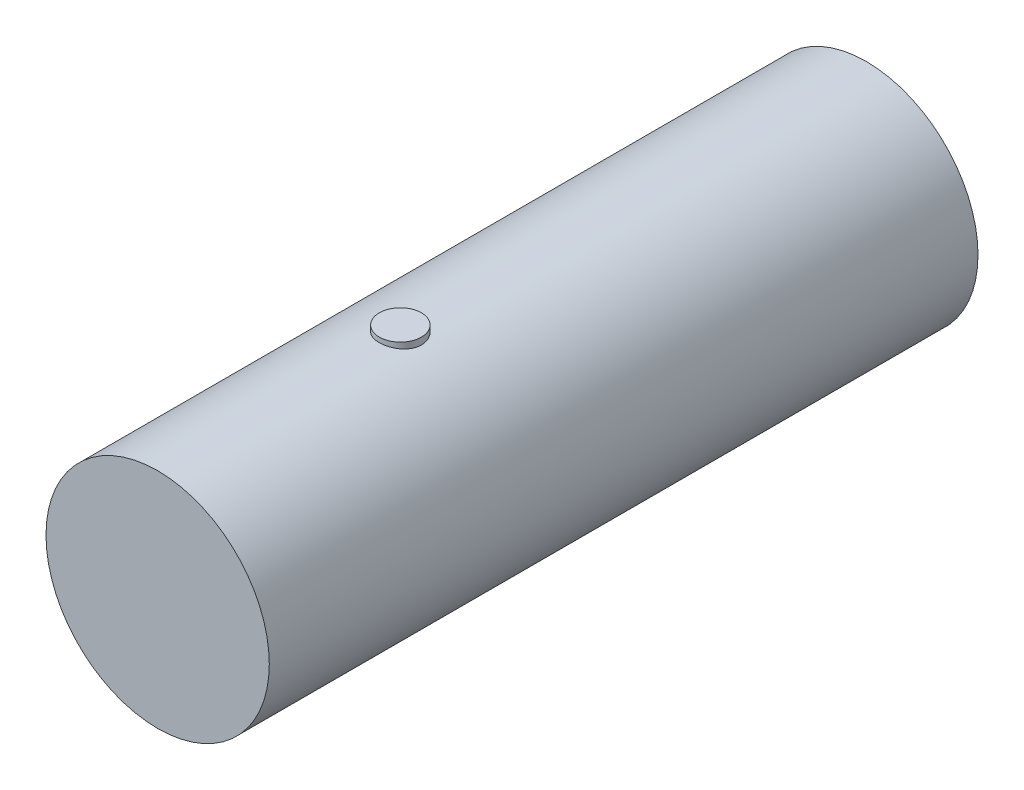
ISO-10303-21;
HEADER;
FILE_DESCRIPTION(('STEP AP214'),'2;1');
FILE_NAME('part.step','',(''),(''),'','','');
FILE_SCHEMA(('AUTOMOTIVE_DESIGN { 1 0 10303 214 1 1 1 1 }'));
ENDSEC;
DATA;
#1=APPLICATION_CONTEXT('core data for automotive mechanical design processes');
#2=APPLICATION_PROTOCOL_DEFINITION('international standard','automotive_design',2000,#1);
#3=PRODUCT_CONTEXT('',#1,'mechanical');
#4=PRODUCT('Part','Part','',(#3));
#5=PRODUCT_RELATED_PRODUCT_CATEGORY('part','',(#4));
#6=PRODUCT_DEFINITION_FORMATION('','',#4);
#7=PRODUCT_DEFINITION_CONTEXT('part definition',#1,'design');
#8=PRODUCT_DEFINITION('design','',#6,#7);
#9=PRODUCT_DEFINITION_SHAPE('','',#8);
#10=(LENGTH_UNIT() NAMED_UNIT(*) SI_UNIT(.MILLI.,.METRE.));
#11=(NAMED_UNIT(*) PLANE_ANGLE_UNIT() SI_UNIT($,.RADIAN.));
#12=(NAMED_UNIT(*) SI_UNIT($,.STERADIAN.) SOLID_ANGLE_UNIT());
#13=UNCERTAINTY_MEASURE_WITH_UNIT(LENGTH_MEASURE(1.E-05),#10,'distance_accuracy_value','');
#14=(GEOMETRIC_REPRESENTATION_CONTEXT(3) GLOBAL_UNCERTAINTY_ASSIGNED_CONTEXT((#13)) GLOBAL_UNIT_ASSIGNED_CONTEXT((#10,
#11,#12)) REPRESENTATION_CONTEXT('',''));
#15=CARTESIAN_POINT('',(0.,0.,0.));
#16=DIRECTION('',(0.,0.,1.));
#17=DIRECTION('',(1.,0.,0.));
#18=AXIS2_PLACEMENT_3D('',#15,#16,#17);
#19=CARTESIAN_POINT('',(0.,0.,730.));
#20=DIRECTION('',(0.,0.,-1.));
#21=DIRECTION('',(-1.,0.,0.));
#22=AXIS2_PLACEMENT_3D('',#19,#20,#21);
#23=CYLINDRICAL_SURFACE('',#22,115.);
#24=CARTESIAN_POINT('',(0.,-115.,501.686343762206));
#25=CARTESIAN_POINT('',(0.603410928443423,-114.999998479308,501.68634033262));
#26=CARTESIAN_POINT('',(1.20690152688971,-114.995238524341,501.661137861267));
#27=CARTESIAN_POINT('',(2.40959715212932,-114.976326973157,501.560511348795));
#28=CARTESIAN_POINT('',(3.0088013905343,-114.962173691952,501.485078297245));
#29=CARTESIAN_POINT('',(4.19902662980545,-114.924857729453,501.284504802048));
#30=CARTESIAN_POINT('',(4.79004102718549,-114.90168817152,501.159326416504));
#31=CARTESIAN_POINT('',(5.95917839647016,-114.84698817239,500.860244081916));
#32=CARTESIAN_POINT('',(6.53730192525976,-114.815458093129,500.686342242144));
#33=CARTESIAN_POINT('',(7.67612155719963,-114.744944836291,500.291317723911));
#34=CARTESIAN_POINT('',(8.23683297430943,-114.70596843676,500.070237968116));
#35=CARTESIAN_POINT('',(9.33752210700834,-114.62161831084,499.582404649574));
#36=CARTESIAN_POINT('',(9.87749961867847,-114.576244521553,499.315650637758));
#37=CARTESIAN_POINT('',(10.9330050367083,-114.480348695138,498.738428238));
#38=CARTESIAN_POINT('',(11.4485354116939,-114.429827179447,498.427964276426));
#39=CARTESIAN_POINT('',(12.4517614280236,-114.325010607594,497.765485877765));
#40=CARTESIAN_POINT('',(12.9394568842235,-114.270715526337,497.41347116435));
#41=CARTESIAN_POINT('',(13.8889055540433,-114.159227774367,496.66627405708));
#42=CARTESIAN_POINT('',(14.3503199242369,-114.10201005857,496.270664775416));
#43=CARTESIAN_POINT('',(15.238283657022,-113.986820308274,495.442180590485));
#44=CARTESIAN_POINT('',(15.6648327608723,-113.928848268182,495.00930541071));
#45=CARTESIAN_POINT('',(16.480193144543,-113.813763709515,494.109199575498));
#46=CARTESIAN_POINT('',(16.8690017720277,-113.756651251588,493.641966509497));
#47=CARTESIAN_POINT('',(17.6061674905007,-113.644893827428,492.67632992873));
#48=CARTESIAN_POINT('',(17.9545244775689,-113.590248867533,492.177926333893));
#49=CARTESIAN_POINT('',(18.6109654730042,-113.484551479374,491.14920361048));
#50=CARTESIAN_POINT('',(18.9187034082234,-113.433531444014,490.618660223656));
#51=CARTESIAN_POINT('',(19.4883292979325,-113.337057122307,489.533011215671));
#52=CARTESIAN_POINT('',(19.7502169355965,-113.29160287442,488.977905424818));
#53=CARTESIAN_POINT('',(20.2261485831619,-113.207602863491,487.847082628774));
#54=CARTESIAN_POINT('',(20.4401958377841,-113.169056631956,487.271367024496));
#55=CARTESIAN_POINT('',(20.8188051191566,-113.100019558419,486.103417576606));
#56=CARTESIAN_POINT('',(20.9833677982044,-113.069528610235,485.511183950845));
#57=CARTESIAN_POINT('',(21.2600711046623,-113.017825905578,484.321513760491));
#58=CARTESIAN_POINT('',(21.3728024273105,-112.996509776887,483.724219095712));
#59=CARTESIAN_POINT('',(21.5477584360319,-112.963277475596,482.522018032881));
#60=CARTESIAN_POINT('',(21.60998347705,-112.951361236936,481.917111688353));
#61=CARTESIAN_POINT('',(21.6834228872716,-112.937286032847,480.70414535094));
#62=CARTESIAN_POINT('',(21.6946413232615,-112.935126289527,480.096085613346));
#63=CARTESIAN_POINT('',(21.6659873155799,-112.940626911343,478.88121837369));
#64=CARTESIAN_POINT('',(21.6261152482131,-112.948287204149,478.274410862437));
#65=CARTESIAN_POINT('',(21.4964769989496,-112.973031045073,477.074554155652));
#66=CARTESIAN_POINT('',(21.4073841144685,-112.98998740768,476.481429438388));
#67=CARTESIAN_POINT('',(21.1804751104198,-113.032742083519,475.304906961762));
#68=CARTESIAN_POINT('',(21.0426594908115,-113.058540306023,474.721509102653));
#69=CARTESIAN_POINT('',(20.7193550090204,-113.118236010455,473.568487993552));
#70=CARTESIAN_POINT('',(20.533864733448,-113.152133732503,472.998865152489));
#71=CARTESIAN_POINT('',(20.1165987670819,-113.2270610209,471.87731785964));
#72=CARTESIAN_POINT('',(19.8848226479777,-113.268090653244,471.325393571684));
#73=CARTESIAN_POINT('',(19.3751334380059,-113.356391365091,470.23969703558));
#74=CARTESIAN_POINT('',(19.0969496888235,-113.403698705315,469.706054816658));
#75=CARTESIAN_POINT('',(18.497434152603,-113.503027293693,468.664050900801));
#76=CARTESIAN_POINT('',(18.1761022614261,-113.555048553224,468.155689264887));
#77=CARTESIAN_POINT('',(17.4924998405668,-113.662360165621,467.167583902252));
#78=CARTESIAN_POINT('',(17.1302257796048,-113.717650800275,466.687842649514));
#79=CARTESIAN_POINT('',(16.3672272296531,-113.829971999644,465.760194353576));
#80=CARTESIAN_POINT('',(15.9665023194669,-113.887002583413,465.31228765919));
#81=CARTESIAN_POINT('',(15.122596567777,-114.002154627059,464.444398286282));
#82=CARTESIAN_POINT('',(14.6788401302188,-114.060278968611,464.024975470015));
#83=CARTESIAN_POINT('',(13.7574398418711,-114.175077585431,463.22494049285));
#84=CARTESIAN_POINT('',(13.2797956140495,-114.231751844558,462.844328763874));
#85=CARTESIAN_POINT('',(12.2938728700095,-114.342060042819,462.124577856691));
#86=CARTESIAN_POINT('',(11.7855938630734,-114.395693933226,461.785439343078));
#87=CARTESIAN_POINT('',(10.7418965635053,-114.498412970124,461.151071908953));
#88=CARTESIAN_POINT('',(10.2064783819104,-114.547498135223,460.85584280881));
#89=CARTESIAN_POINT('',(9.11150541665886,-114.639795365827,460.311110366966));
#90=CARTESIAN_POINT('',(8.55192038531121,-114.6829997727,460.061666507819));
#91=CARTESIAN_POINT('',(7.41320565943902,-114.762232800078,459.610864274964));
#92=CARTESIAN_POINT('',(6.83407591222441,-114.798261401234,459.409506030902));
#93=CARTESIAN_POINT('',(5.66047874275129,-114.862109808594,459.056458202383));
#94=CARTESIAN_POINT('',(5.06601266946913,-114.889930334117,458.904764265438));
#95=CARTESIAN_POINT('',(3.86602914611988,-114.936566460762,458.652230985896));
#96=CARTESIAN_POINT('',(3.26051184678311,-114.955382184607,458.551390950226));
#97=CARTESIAN_POINT('',(2.05199309495855,-114.983256094479,458.402501234785));
#98=CARTESIAN_POINT('',(1.44908919481187,-114.992455849795,458.353685421447));
#99=CARTESIAN_POINT('',(0.241243315370328,-115.001332709821,458.306577626242));
#100=CARTESIAN_POINT('',(-0.363698643618266,-115.001009909131,458.308285142464));
#101=CARTESIAN_POINT('',(-1.57121658735387,-114.990851040459,458.362208442856));
#102=CARTESIAN_POINT('',(-2.1737926813114,-114.981015416907,458.414421867437));
#103=CARTESIAN_POINT('',(-3.37226148029988,-114.952108084768,458.568938255338));
#104=CARTESIAN_POINT('',(-3.96815419641428,-114.933036391501,458.671241135579));
#105=CARTESIAN_POINT('',(-5.14430955734777,-114.886377552673,458.924124092238));
#106=CARTESIAN_POINT('',(-5.72465864144907,-114.858859084722,459.074315175869));
#107=CARTESIAN_POINT('',(-6.8705461376929,-114.796014185086,459.422060408162));
#108=CARTESIAN_POINT('',(-7.43608465366947,-114.760687808155,459.619614224674));
#109=CARTESIAN_POINT('',(-8.54851169703409,-114.683189163443,460.060630039465));
#110=CARTESIAN_POINT('',(-9.09539925892533,-114.641016541902,460.304094410132));
#111=CARTESIAN_POINT('',(-10.1668145490839,-114.55097092541,460.835165217287));
#112=CARTESIAN_POINT('',(-10.6913420219751,-114.503097865377,461.12277215776));
#113=CARTESIAN_POINT('',(-11.7202015596036,-114.402390813311,461.74351296201));
#114=CARTESIAN_POINT('',(-12.2242468280903,-114.349507898652,462.077114276455));
#115=CARTESIAN_POINT('',(-13.2025337839056,-114.240690552008,462.785030769096));
#116=CARTESIAN_POINT('',(-13.6767752835203,-114.184756100807,463.159346203682));
#117=CARTESIAN_POINT('',(-14.5923251341038,-114.07136750167,463.94615600913));
#118=CARTESIAN_POINT('',(-15.0336307476665,-114.013913227953,464.358653547058));
#119=CARTESIAN_POINT('',(-15.8803134988249,-113.899070279191,465.219017906046));
#120=CARTESIAN_POINT('',(-16.28569036246,-113.841681604649,465.666884996753));
#121=CARTESIAN_POINT('',(-17.0629757498403,-113.727794594203,466.601246019251));
#122=CARTESIAN_POINT('',(-17.4343602831979,-113.671318642953,467.088178765694));
#123=CARTESIAN_POINT('',(-18.134790777787,-113.561679605116,468.09195991537));
#124=CARTESIAN_POINT('',(-18.4638363080415,-113.508516552253,468.608808623046));
#125=CARTESIAN_POINT('',(-19.0772010518043,-113.40704156121,469.668840283264));
#126=CARTESIAN_POINT('',(-19.3615213502893,-113.358729505362,470.212022596568));
#127=CARTESIAN_POINT('',(-19.8833308938377,-113.268368548563,471.320936616474));
#128=CARTESIAN_POINT('',(-20.1208205564517,-113.226319591771,471.88666812197));
#129=CARTESIAN_POINT('',(-20.5461099237842,-113.149917602119,473.033849212043));
#130=CARTESIAN_POINT('',(-20.7341475917761,-113.115527840436,473.615208111934));
#131=CARTESIAN_POINT('',(-21.0605919767159,-113.055203564872,474.792131818335));
#132=CARTESIAN_POINT('',(-21.198998783084,-113.029269035756,475.387696599248));
#133=CARTESIAN_POINT('',(-21.4250673618696,-112.986635239289,476.588650344653));
#134=CARTESIAN_POINT('',(-21.5127340085041,-112.969935084869,477.194038359756));
#135=CARTESIAN_POINT('',(-21.6366306524008,-112.946271348791,478.410241852668));
#136=CARTESIAN_POINT('',(-21.6728612876089,-112.939307646376,479.021057263068));
#137=CARTESIAN_POINT('',(-21.6934252885051,-112.935359346544,480.23375281502));
#138=CARTESIAN_POINT('',(-21.678584262859,-112.938215995593,480.83561860039));
#139=CARTESIAN_POINT('',(-21.5989429051676,-112.953474073414,482.035908051277));
#140=CARTESIAN_POINT('',(-21.5341431419893,-112.965875393504,482.63433175591));
#141=CARTESIAN_POINT('',(-21.3550973053761,-112.999858853634,483.82346019942));
#142=CARTESIAN_POINT('',(-21.2408517940696,-113.021440889302,484.41416502597));
#143=CARTESIAN_POINT('',(-20.9638031053921,-113.073156801196,485.583691139615));
#144=CARTESIAN_POINT('',(-20.8009997423754,-113.103290710116,486.162512381267));
#145=CARTESIAN_POINT('',(-20.4284364788906,-113.171174462504,487.303133287709));
#146=CARTESIAN_POINT('',(-20.2187677981103,-113.20890949706,487.864963644096));
#147=CARTESIAN_POINT('',(-19.7538482350839,-113.29095798076,488.968930455403));
#148=CARTESIAN_POINT('',(-19.4985974893121,-113.335271410207,489.511066969281));
#149=CARTESIAN_POINT('',(-18.944334261465,-113.429234186239,490.572035915902));
#150=CARTESIAN_POINT('',(-18.6453194519445,-113.478883816576,491.09086710731));
#151=CARTESIAN_POINT('',(-18.0056282270393,-113.582138893698,492.101762267624));
#152=CARTESIAN_POINT('',(-17.6649513096558,-113.635744388146,492.593825913896));
#153=CARTESIAN_POINT('',(-16.938796703294,-113.746270407383,493.555184169366));
#154=CARTESIAN_POINT('',(-16.5527185652309,-113.803228846821,494.02402098587));
#155=CARTESIAN_POINT('',(-15.7426791519397,-113.91810806804,494.927616435533));
#156=CARTESIAN_POINT('',(-15.3187174069761,-113.976028861747,495.362374646011));
#157=CARTESIAN_POINT('',(-14.4356905622867,-114.091231406851,496.194957774628));
#158=CARTESIAN_POINT('',(-13.9766174013943,-114.148513008016,496.592774164663));
#159=CARTESIAN_POINT('',(-13.0265594141635,-114.26083102561,497.348623345724));
#160=CARTESIAN_POINT('',(-12.535574862021,-114.315867461323,497.706656478514));
#161=CARTESIAN_POINT('',(-11.5203936484508,-114.422652249633,498.383514381693));
#162=CARTESIAN_POINT('',(-10.9959347520517,-114.474366005806,498.701951457141));
#163=CARTESIAN_POINT('',(-9.92150548653104,-114.572486611425,499.29345243537));
#164=CARTESIAN_POINT('',(-9.37153372271536,-114.618893170264,499.566513853885));
#165=CARTESIAN_POINT('',(-8.25046797590312,-114.70503723464,500.064977153194));
#166=CARTESIAN_POINT('',(-7.6793923828443,-114.744780386905,500.290419430103));
#167=CARTESIAN_POINT('',(-6.51981205738599,-114.816502484042,500.69216975616));
#168=CARTESIAN_POINT('',(-5.931310848707,-114.848482986769,500.868487664934));
#169=CARTESIAN_POINT('',(-4.90108937243963,-114.896341831026,501.130038938639));
#170=CARTESIAN_POINT('',(-4.46240348079156,-114.914237937831,501.227016949646));
#171=CARTESIAN_POINT('',(-3.57959424367783,-114.945124004593,501.393591864407));
#172=CARTESIAN_POINT('',(-3.13547002667402,-114.95811316726,501.463184318573));
#173=CARTESIAN_POINT('',(-2.24364577653995,-114.978976301138,501.574649459001));
#174=CARTESIAN_POINT('',(-1.79594581475952,-114.986850374158,501.616522696975));
#175=CARTESIAN_POINT('',(-0.898845102463906,-114.997362349002,501.672368776409));
#176=CARTESIAN_POINT('',(-0.449444651163409,-115.000001132672,501.6863463167));
#177=CARTESIAN_POINT('',(0.,-115.,501.686343762206));
#178=B_SPLINE_CURVE_WITH_KNOTS('',3,(#24,#25,#26,#27,#28,#29,#30,#31,#32,#33,#34,#35,#36,#37,
#38,#39,#40,#41,#42,#43,#44,#45,#46,#47,#48,#49,#50,#51,#52,#53,#54,#55,#56,#57,#58,#59,#60,#61,
#62,#63,#64,#65,#66,#67,#68,#69,#70,#71,#72,#73,#74,#75,#76,#77,#78,#79,#80,#81,#82,#83,#84,#85,
#86,#87,#88,#89,#90,#91,#92,#93,#94,#95,#96,#97,#98,#99,#100,#101,#102,#103,#104,#105,#106,#107,
#108,#109,#110,#111,#112,#113,#114,#115,#116,#117,#118,#119,#120,#121,#122,#123,#124,#125,#126,
#127,#128,#129,#130,#131,#132,#133,#134,#135,#136,#137,#138,#139,#140,#141,#142,#143,#144,#145,
#146,#147,#148,#149,#150,#151,#152,#153,#154,#155,#156,#157,#158,#159,#160,#161,#162,#163,#164,
#165,#166,#167,#168,#169,#170,#171,#172,#173,#174,#175,#176,#177),.UNSPECIFIED.,.T.,.F.,(4,2,2,
2,2,2,2,2,2,2,2,2,2,2,2,2,2,2,2,2,2,2,2,2,2,2,2,2,2,2,2,2,2,2,2,2,2,2,2,2,2,2,2,2,2,2,2,2,2,2,2,
2,2,2,2,2,2,2,2,2,2,2,2,2,2,2,2,2,2,2,2,2,2,2,2,2,4),(0.,1.80982738189871,3.61997950062632,
5.43151492163559,7.2429719321787,9.05278784489411,10.8626215526822,12.672272116011,
14.481934714847,16.3112300405178,18.1405389404751,19.9699763081808,21.7994183756038,
23.6435595876974,25.4877135423211,27.3317423812686,29.17574691146,30.9981809842248,
32.8206022492898,34.6428782090966,36.4651407470994,38.2630723295065,40.060985463307,
41.8589519052006,43.6569349855172,45.4657964120468,47.2746622043741,49.0836841313884,
50.8927258769677,52.7306443612358,54.5685832972012,56.4065516816789,58.244512546905,
60.0848445806514,61.9251815760959,63.7653572445518,65.6055078331399,67.4181682905918,
69.2308107406389,71.0433685097984,72.8559232726359,74.6541145992614,76.4522933157359,
78.2505649769788,80.0488571709119,81.866997343491,83.6851489661647,85.5034515333067,
87.3217679640126,89.1645615460227,91.0073738847022,92.8501415122283,94.6928927085549,
96.5266072413301,98.3603184702769,100.193853519436,102.027365827593,103.831378322132,
105.635370275154,107.439341719866,109.243320061585,111.043817212474,112.844308972704,
114.644896520881,116.445505766995,118.273389564665,120.101296030221,121.929623428606,
123.757935119317,125.60293442217,127.448034703441,129.291563412592,131.134721844798,
132.48278885525,133.831074808449,135.179333925048,136.527365917809),.UNSPECIFIED.);
#179=CARTESIAN_POINT('',(0.,-115.,501.686343762206));
#180=VERTEX_POINT('',#179);
#181=EDGE_CURVE('E35',#180,#180,#178,.T.);
#182=ORIENTED_EDGE('',*,*,#181,.T.);
#183=EDGE_LOOP('',(#182));
#184=FACE_BOUND('',#183,.T.);
#185=CARTESIAN_POINT('',(0.,115.,501.686343762206));
#186=CARTESIAN_POINT('',(-0.603410928443422,114.999998479308,501.68634033262));
#187=CARTESIAN_POINT('',(-1.20690152688971,114.995238524341,501.661137861267));
#188=CARTESIAN_POINT('',(-2.40959715212932,114.976326973157,501.560511348795));
#189=CARTESIAN_POINT('',(-3.0088013905343,114.962173691952,501.485078297245));
#190=CARTESIAN_POINT('',(-4.19902662980545,114.924857729453,501.284504802048));
#191=CARTESIAN_POINT('',(-4.79004102718548,114.90168817152,501.159326416504));
#192=CARTESIAN_POINT('',(-5.95917839647016,114.84698817239,500.860244081916));
#193=CARTESIAN_POINT('',(-6.53730192525976,114.815458093129,500.686342242144));
#194=CARTESIAN_POINT('',(-7.67612155719963,114.744944836291,500.291317723911));
#195=CARTESIAN_POINT('',(-8.23683297430943,114.70596843676,500.070237968116));
#196=CARTESIAN_POINT('',(-9.33752210700834,114.62161831084,499.582404649574));
#197=CARTESIAN_POINT('',(-9.87749961867846,114.576244521553,499.315650637758));
#198=CARTESIAN_POINT('',(-10.9330050367083,114.480348695138,498.738428238));
#199=CARTESIAN_POINT('',(-11.4485354116939,114.429827179447,498.427964276426));
#200=CARTESIAN_POINT('',(-12.4517614280236,114.325010607594,497.765485877765));
#201=CARTESIAN_POINT('',(-12.9394568842235,114.270715526337,497.41347116435));
#202=CARTESIAN_POINT('',(-13.8889055540433,114.159227774367,496.66627405708));
#203=CARTESIAN_POINT('',(-14.3503199242369,114.10201005857,496.270664775416));
#204=CARTESIAN_POINT('',(-15.238283657022,113.986820308274,495.442180590485));
#205=CARTESIAN_POINT('',(-15.6648327608723,113.928848268182,495.00930541071));
#206=CARTESIAN_POINT('',(-16.480193144543,113.813763709515,494.109199575498));
#207=CARTESIAN_POINT('',(-16.8690017720277,113.756651251588,493.641966509497));
#208=CARTESIAN_POINT('',(-17.6061674905007,113.644893827428,492.67632992873));
#209=CARTESIAN_POINT('',(-17.9545244775689,113.590248867533,492.177926333893));
#210=CARTESIAN_POINT('',(-18.6109654730042,113.484551479374,491.14920361048));
#211=CARTESIAN_POINT('',(-18.9187034082234,113.433531444014,490.618660223656));
#212=CARTESIAN_POINT('',(-19.4883292979325,113.337057122307,489.533011215671));
#213=CARTESIAN_POINT('',(-19.7502169355965,113.29160287442,488.977905424818));
#214=CARTESIAN_POINT('',(-20.2261485831619,113.207602863491,487.847082628774));
#215=CARTESIAN_POINT('',(-20.4401958377841,113.169056631956,487.271367024496));
#216=CARTESIAN_POINT('',(-20.8188051191566,113.100019558419,486.103417576606));
#217=CARTESIAN_POINT('',(-20.9833677982044,113.069528610235,485.511183950845));
#218=CARTESIAN_POINT('',(-21.2600711046623,113.017825905578,484.321513760491));
#219=CARTESIAN_POINT('',(-21.3728024273105,112.996509776887,483.724219095712));
#220=CARTESIAN_POINT('',(-21.5477584360319,112.963277475596,482.522018032881));
#221=CARTESIAN_POINT('',(-21.60998347705,112.951361236936,481.917111688353));
#222=CARTESIAN_POINT('',(-21.6834228872716,112.937286032847,480.70414535094));
#223=CARTESIAN_POINT('',(-21.6946413232615,112.935126289527,480.096085613346));
#224=CARTESIAN_POINT('',(-21.6659873155799,112.940626911343,478.88121837369));
#225=CARTESIAN_POINT('',(-21.6261152482131,112.948287204149,478.274410862437));
#226=CARTESIAN_POINT('',(-21.4964769989496,112.973031045073,477.074554155652));
#227=CARTESIAN_POINT('',(-21.4073841144685,112.98998740768,476.481429438388));
#228=CARTESIAN_POINT('',(-21.1804751104198,113.032742083519,475.304906961762));
#229=CARTESIAN_POINT('',(-21.0426594908115,113.058540306023,474.721509102653));
#230=CARTESIAN_POINT('',(-20.7193550090204,113.118236010455,473.568487993552));
#231=CARTESIAN_POINT('',(-20.533864733448,113.152133732503,472.998865152489));
#232=CARTESIAN_POINT('',(-20.1165987670819,113.2270610209,471.87731785964));
#233=CARTESIAN_POINT('',(-19.8848226479777,113.268090653244,471.325393571684));
#234=CARTESIAN_POINT('',(-19.3751334380059,113.356391365091,470.23969703558));
#235=CARTESIAN_POINT('',(-19.0969496888235,113.403698705315,469.706054816658));
#236=CARTESIAN_POINT('',(-18.497434152603,113.503027293693,468.664050900801));
#237=CARTESIAN_POINT('',(-18.1761022614261,113.555048553224,468.155689264887));
#238=CARTESIAN_POINT('',(-17.4924998405668,113.662360165621,467.167583902252));
#239=CARTESIAN_POINT('',(-17.1302257796048,113.717650800275,466.687842649514));
#240=CARTESIAN_POINT('',(-16.3672272296531,113.829971999644,465.760194353576));
#241=CARTESIAN_POINT('',(-15.9665023194669,113.887002583413,465.31228765919));
#242=CARTESIAN_POINT('',(-15.122596567777,114.002154627059,464.444398286282));
#243=CARTESIAN_POINT('',(-14.6788401302188,114.060278968611,464.024975470015));
#244=CARTESIAN_POINT('',(-13.7574398418711,114.175077585431,463.22494049285));
#245=CARTESIAN_POINT('',(-13.2797956140495,114.231751844558,462.844328763874));
#246=CARTESIAN_POINT('',(-12.2938728700095,114.342060042819,462.124577856691));
#247=CARTESIAN_POINT('',(-11.7855938630734,114.395693933226,461.785439343078));
#248=CARTESIAN_POINT('',(-10.7418965635053,114.498412970124,461.151071908953));
#249=CARTESIAN_POINT('',(-10.2064783819104,114.547498135223,460.85584280881));
#250=CARTESIAN_POINT('',(-9.11150541665892,114.639795365827,460.311110366966));
#251=CARTESIAN_POINT('',(-8.55192038531128,114.6829997727,460.061666507819));
#252=CARTESIAN_POINT('',(-7.41320565943908,114.762232800078,459.610864274964));
#253=CARTESIAN_POINT('',(-6.83407591222445,114.798261401234,459.409506030902));
#254=CARTESIAN_POINT('',(-5.66047874275131,114.862109808594,459.056458202384));
#255=CARTESIAN_POINT('',(-5.06601266946916,114.889930334117,458.904764265438));
#256=CARTESIAN_POINT('',(-3.86602914611991,114.936566460762,458.652230985896));
#257=CARTESIAN_POINT('',(-3.26051184678314,114.955382184607,458.551390950226));
#258=CARTESIAN_POINT('',(-2.05199309495857,114.983256094479,458.402501234785));
#259=CARTESIAN_POINT('',(-1.44908919481189,114.992455849795,458.353685421447));
#260=CARTESIAN_POINT('',(-0.241243315370348,115.001332709821,458.306577626242));
#261=CARTESIAN_POINT('',(0.363698643618247,115.001009909131,458.308285142464));
#262=CARTESIAN_POINT('',(1.57121658735385,114.990851040459,458.362208442856));
#263=CARTESIAN_POINT('',(2.17379268131138,114.981015416907,458.414421867437));
#264=CARTESIAN_POINT('',(3.37226148029986,114.952108084768,458.568938255338));
#265=CARTESIAN_POINT('',(3.96815419641426,114.933036391501,458.671241135579));
#266=CARTESIAN_POINT('',(5.14430955734775,114.886377552673,458.924124092238));
#267=CARTESIAN_POINT('',(5.72465864144905,114.858859084722,459.074315175869));
#268=CARTESIAN_POINT('',(6.87054613769288,114.796014185086,459.422060408162));
#269=CARTESIAN_POINT('',(7.43608465366945,114.760687808155,459.619614224674));
#270=CARTESIAN_POINT('',(8.54851169703406,114.683189163443,460.060630039465));
#271=CARTESIAN_POINT('',(9.09539925892529,114.641016541902,460.304094410132));
#272=CARTESIAN_POINT('',(10.1668145490839,114.55097092541,460.835165217287));
#273=CARTESIAN_POINT('',(10.6913420219751,114.503097865377,461.12277215776));
#274=CARTESIAN_POINT('',(11.7202015596036,114.402390813311,461.74351296201));
#275=CARTESIAN_POINT('',(12.2242468280903,114.349507898652,462.077114276455));
#276=CARTESIAN_POINT('',(13.2025337839056,114.240690552008,462.785030769096));
#277=CARTESIAN_POINT('',(13.6767752835203,114.184756100807,463.159346203682));
#278=CARTESIAN_POINT('',(14.5923251341038,114.07136750167,463.94615600913));
#279=CARTESIAN_POINT('',(15.0336307476665,114.013913227953,464.358653547058));
#280=CARTESIAN_POINT('',(15.8803134988249,113.899070279191,465.219017906046));
#281=CARTESIAN_POINT('',(16.28569036246,113.841681604649,465.666884996753));
#282=CARTESIAN_POINT('',(17.0629757498403,113.727794594203,466.601246019251));
#283=CARTESIAN_POINT('',(17.4343602831979,113.671318642953,467.088178765694));
#284=CARTESIAN_POINT('',(18.134790777787,113.561679605116,468.09195991537));
#285=CARTESIAN_POINT('',(18.4638363080414,113.508516552253,468.608808623046));
#286=CARTESIAN_POINT('',(19.0772010518043,113.40704156121,469.668840283264));
#287=CARTESIAN_POINT('',(19.3615213502892,113.358729505362,470.212022596568));
#288=CARTESIAN_POINT('',(19.8833308938376,113.268368548563,471.320936616474));
#289=CARTESIAN_POINT('',(20.1208205564517,113.226319591771,471.88666812197));
#290=CARTESIAN_POINT('',(20.5461099237842,113.149917602119,473.033849212043));
#291=CARTESIAN_POINT('',(20.7341475917761,113.115527840436,473.615208111934));
#292=CARTESIAN_POINT('',(21.0605919767159,113.055203564872,474.792131818335));
#293=CARTESIAN_POINT('',(21.198998783084,113.029269035756,475.387696599248));
#294=CARTESIAN_POINT('',(21.4250673618696,112.986635239289,476.588650344653));
#295=CARTESIAN_POINT('',(21.5127340085041,112.969935084869,477.194038359756));
#296=CARTESIAN_POINT('',(21.6366306524008,112.946271348791,478.410241852668));
#297=CARTESIAN_POINT('',(21.6728612876089,112.939307646376,479.021057263068));
#298=CARTESIAN_POINT('',(21.6934252885051,112.935359346544,480.23375281502));
#299=CARTESIAN_POINT('',(21.678584262859,112.938215995593,480.83561860039));
#300=CARTESIAN_POINT('',(21.5989429051676,112.953474073414,482.035908051277));
#301=CARTESIAN_POINT('',(21.5341431419893,112.965875393504,482.63433175591));
#302=CARTESIAN_POINT('',(21.3550973053761,112.999858853634,483.82346019942));
#303=CARTESIAN_POINT('',(21.2408517940696,113.021440889302,484.41416502597));
#304=CARTESIAN_POINT('',(20.9638031053921,113.073156801196,485.583691139615));
#305=CARTESIAN_POINT('',(20.8009997423754,113.103290710116,486.162512381267));
#306=CARTESIAN_POINT('',(20.4284364788906,113.171174462504,487.303133287709));
#307=CARTESIAN_POINT('',(20.2187677981103,113.20890949706,487.864963644096));
#308=CARTESIAN_POINT('',(19.7538482350839,113.29095798076,488.968930455403));
#309=CARTESIAN_POINT('',(19.4985974893121,113.335271410207,489.511066969281));
#310=CARTESIAN_POINT('',(18.944334261465,113.429234186239,490.572035915902));
#311=CARTESIAN_POINT('',(18.6453194519445,113.478883816576,491.09086710731));
#312=CARTESIAN_POINT('',(18.0056282270393,113.582138893698,492.101762267624));
#313=CARTESIAN_POINT('',(17.6649513096559,113.635744388146,492.593825913896));
#314=CARTESIAN_POINT('',(16.9387967032941,113.746270407383,493.555184169366));
#315=CARTESIAN_POINT('',(16.5527185652309,113.803228846821,494.02402098587));
#316=CARTESIAN_POINT('',(15.7426791519398,113.91810806804,494.927616435533));
#317=CARTESIAN_POINT('',(15.3187174069762,113.976028861747,495.362374646011));
#318=CARTESIAN_POINT('',(14.4356905622868,114.091231406851,496.194957774628));
#319=CARTESIAN_POINT('',(13.9766174013944,114.148513008016,496.592774164663));
#320=CARTESIAN_POINT('',(13.0265594141636,114.26083102561,497.348623345724));
#321=CARTESIAN_POINT('',(12.535574862021,114.315867461323,497.706656478514));
#322=CARTESIAN_POINT('',(11.5203936484508,114.422652249633,498.383514381693));
#323=CARTESIAN_POINT('',(10.9959347520517,114.474366005806,498.701951457141));
#324=CARTESIAN_POINT('',(9.92150548653107,114.572486611425,499.29345243537));
#325=CARTESIAN_POINT('',(9.37153372271539,114.618893170264,499.566513853885));
#326=CARTESIAN_POINT('',(8.25046797590314,114.70503723464,500.064977153194));
#327=CARTESIAN_POINT('',(7.67939238284431,114.744780386905,500.290419430103));
#328=CARTESIAN_POINT('',(6.519812057386,114.816502484042,500.69216975616));
#329=CARTESIAN_POINT('',(5.93131084870702,114.848482986769,500.868487664934));
#330=CARTESIAN_POINT('',(4.90108937243967,114.896341831026,501.130038938638));
#331=CARTESIAN_POINT('',(4.46240348079161,114.914237937831,501.227016949645));
#332=CARTESIAN_POINT('',(3.57959424367789,114.945124004593,501.393591864407));
#333=CARTESIAN_POINT('',(3.13547002667406,114.95811316726,501.463184318573));
#334=CARTESIAN_POINT('',(2.24364577653997,114.978976301138,501.574649459001));
#335=CARTESIAN_POINT('',(1.79594581475953,114.986850374158,501.616522696975));
#336=CARTESIAN_POINT('',(0.898845102463902,114.997362349002,501.672368776409));
#337=CARTESIAN_POINT('',(0.449444651163408,115.000001132672,501.6863463167));
#338=CARTESIAN_POINT('',(0.,115.,501.686343762206));
#339=B_SPLINE_CURVE_WITH_KNOTS('',3,(#185,#186,#187,#188,#189,#190,#191,#192,#193,#194,#195,
#196,#197,#198,#199,#200,#201,#202,#203,#204,#205,#206,#207,#208,#209,#210,#211,#212,#213,#214,
#215,#216,#217,#218,#219,#220,#221,#222,#223,#224,#225,#226,#227,#228,#229,#230,#231,#232,#233,
#234,#235,#236,#237,#238,#239,#240,#241,#242,#243,#244,#245,#246,#247,#248,#249,#250,#251,#252,
#253,#254,#255,#256,#257,#258,#259,#260,#261,#262,#263,#264,#265,#266,#267,#268,#269,#270,#271,
#272,#273,#274,#275,#276,#277,#278,#279,#280,#281,#282,#283,#284,#285,#286,#287,#288,#289,#290,
#291,#292,#293,#294,#295,#296,#297,#298,#299,#300,#301,#302,#303,#304,#305,#306,#307,#308,#309,
#310,#311,#312,#313,#314,#315,#316,#317,#318,#319,#320,#321,#322,#323,#324,#325,#326,#327,#328,
#329,#330,#331,#332,#333,#334,#335,#336,#337,#338),.UNSPECIFIED.,.T.,.F.,(4,2,2,2,2,2,2,2,2,2,2,
2,2,2,2,2,2,2,2,2,2,2,2,2,2,2,2,2,2,2,2,2,2,2,2,2,2,2,2,2,2,2,2,2,2,2,2,2,2,2,2,2,2,2,2,2,2,2,2,
2,2,2,2,2,2,2,2,2,2,2,2,2,2,2,2,2,4),(0.,1.80982738189871,3.61997950062632,5.43151492163559,
7.2429719321787,9.05278784489411,10.8626215526822,12.672272116011,14.481934714847,
16.3112300405178,18.1405389404751,19.9699763081808,21.7994183756038,23.6435595876974,
25.4877135423211,27.3317423812686,29.17574691146,30.9981809842248,32.8206022492898,
34.6428782090966,36.4651407470994,38.2630723295065,40.060985463307,41.8589519052006,
43.6569349855172,45.4657964120468,47.2746622043741,49.0836841313884,50.8927258769677,
52.7306443612358,54.5685832972012,56.4065516816789,58.244512546905,60.0848445806514,
61.9251815760958,63.7653572445518,65.6055078331399,67.4181682905917,69.2308107406389,
71.0433685097984,72.8559232726359,74.6541145992614,76.4522933157359,78.2505649769788,
80.0488571709119,81.866997343491,83.6851489661646,85.5034515333067,87.3217679640125,
89.1645615460226,91.0073738847021,92.8501415122283,94.6928927085549,96.5266072413301,
98.3603184702769,100.193853519436,102.027365827593,103.831378322131,105.635370275154,
107.439341719866,109.243320061585,111.043817212474,112.844308972704,114.644896520881,
116.445505766995,118.273389564665,120.101296030221,121.929623428606,123.757935119317,
125.60293442217,127.44803470344,129.291563412592,131.134721844798,132.482788855249,
133.831074808449,135.179333925048,136.527365917809),.UNSPECIFIED.);
#340=CARTESIAN_POINT('',(0.,115.,501.686343762206));
#341=VERTEX_POINT('',#340);
#342=EDGE_CURVE('E52',#341,#341,#339,.T.);
#343=ORIENTED_EDGE('',*,*,#342,.T.);
#344=EDGE_LOOP('',(#343));
#345=FACE_BOUND('',#344,.T.);
#346=CARTESIAN_POINT('',(0.,0.,730.));
#347=DIRECTION('',(0.,0.,1.));
#348=DIRECTION('',(1.,0.,0.));
#349=AXIS2_PLACEMENT_3D('',#346,#347,#348);
#350=CIRCLE('',#349,115.);
#351=CARTESIAN_POINT('',(115.,0.,730.));
#352=VERTEX_POINT('',#351);
#353=EDGE_CURVE('E10',#352,#352,#350,.T.);
#354=ORIENTED_EDGE('',*,*,#353,.F.);
#355=EDGE_LOOP('',(#354));
#356=FACE_BOUND('',#355,.T.);
#357=CARTESIAN_POINT('',(0.,0.,0.));
#358=DIRECTION('',(0.,0.,1.));
#359=DIRECTION('',(1.,0.,0.));
#360=AXIS2_PLACEMENT_3D('',#357,#358,#359);
#361=CIRCLE('',#360,115.);
#362=CARTESIAN_POINT('',(115.,0.,0.));
#363=VERTEX_POINT('',#362);
#364=EDGE_CURVE('E43',#363,#363,#361,.T.);
#365=ORIENTED_EDGE('',*,*,#364,.T.);
#366=EDGE_LOOP('',(#365));
#367=FACE_BOUND('',#366,.T.);
#368=ADVANCED_FACE('F31',(#184,#345,#356,#367),#23,.T.);
#369=CARTESIAN_POINT('',(0.,0.,730.));
#370=DIRECTION('',(0.,0.,1.));
#371=DIRECTION('',(1.,0.,0.));
#372=AXIS2_PLACEMENT_3D('',#369,#370,#371);
#373=PLANE('',#372);
#374=ORIENTED_EDGE('',*,*,#353,.T.);
#375=EDGE_LOOP('',(#374));
#376=FACE_BOUND('',#375,.T.);
#377=ADVANCED_FACE('F66',(#376),#373,.T.);
#378=CARTESIAN_POINT('',(0.,0.,0.));
#379=DIRECTION('',(0.,0.,1.));
#380=DIRECTION('',(1.,0.,0.));
#381=AXIS2_PLACEMENT_3D('',#378,#379,#380);
#382=PLANE('',#381);
#383=ORIENTED_EDGE('',*,*,#364,.F.);
#384=EDGE_LOOP('',(#383));
#385=FACE_BOUND('',#384,.T.);
#386=ADVANCED_FACE('F69',(#385),#382,.F.);
#387=CARTESIAN_POINT('',(0.,120.,480.));
#388=DIRECTION('',(0.,1.,0.));
#389=DIRECTION('',(0.,0.,1.));
#390=AXIS2_PLACEMENT_3D('',#387,#388,#389);
#391=PLANE('',#390);
#392=CARTESIAN_POINT('',(0.,120.,480.));
#393=DIRECTION('',(0.,1.,0.));
#394=DIRECTION('',(0.,0.,1.));
#395=AXIS2_PLACEMENT_3D('',#392,#393,#394);
#396=CIRCLE('',#395,21.6863437622064);
#397=CARTESIAN_POINT('',(0.,120.,501.686343762206));
#398=VERTEX_POINT('',#397);
#399=EDGE_CURVE('E96',#398,#398,#396,.T.);
#400=ORIENTED_EDGE('',*,*,#399,.T.);
#401=EDGE_LOOP('',(#400));
#402=FACE_BOUND('',#401,.T.);
#403=ADVANCED_FACE('F71',(#402),#391,.T.);
#404=CARTESIAN_POINT('',(0.,-120.,480.));
#405=DIRECTION('',(0.,1.,0.));
#406=DIRECTION('',(0.,0.,1.));
#407=AXIS2_PLACEMENT_3D('',#404,#405,#406);
#408=CYLINDRICAL_SURFACE('',#407,21.6863437622064);
#409=ORIENTED_EDGE('',*,*,#399,.F.);
#410=EDGE_LOOP('',(#409));
#411=FACE_BOUND('',#410,.T.);
#412=ORIENTED_EDGE('',*,*,#342,.F.);
#413=EDGE_LOOP('',(#412));
#414=FACE_BOUND('',#413,.T.);
#415=ADVANCED_FACE('F63',(#411,#414),#408,.T.);
#416=CARTESIAN_POINT('',(0.,-120.,480.));
#417=DIRECTION('',(0.,1.,0.));
#418=DIRECTION('',(0.,0.,1.));
#419=AXIS2_PLACEMENT_3D('',#416,#417,#418);
#420=CIRCLE('',#419,21.6863437622064);
#421=CARTESIAN_POINT('',(0.,-120.,501.686343762206));
#422=VERTEX_POINT('',#421);
#423=EDGE_CURVE('E50',#422,#422,#420,.T.);
#424=ORIENTED_EDGE('',*,*,#423,.T.);
#425=EDGE_LOOP('',(#424));
#426=FACE_BOUND('',#425,.T.);
#427=ORIENTED_EDGE('',*,*,#181,.F.);
#428=EDGE_LOOP('',(#427));
#429=FACE_BOUND('',#428,.T.);
#430=ADVANCED_FACE('F57',(#426,#429),#408,.T.);
#431=CARTESIAN_POINT('',(0.,-120.,480.));
#432=DIRECTION('',(0.,1.,0.));
#433=DIRECTION('',(0.,0.,1.));
#434=AXIS2_PLACEMENT_3D('',#431,#432,#433);
#435=PLANE('',#434);
#436=ORIENTED_EDGE('',*,*,#423,.F.);
#437=EDGE_LOOP('',(#436));
#438=FACE_BOUND('',#437,.T.);
#439=ADVANCED_FACE('F62',(#438),#435,.F.);
#440=CLOSED_SHELL('',(#368,#377,#386,#403,#415,#430,#439));
#441=MANIFOLD_SOLID_BREP('B2',#440);
#442=ADVANCED_BREP_SHAPE_REPRESENTATION('',(#18,#441),#14);
#443=SHAPE_DEFINITION_REPRESENTATION(#9,#442);
ENDSEC;
END-ISO-10303-21;
